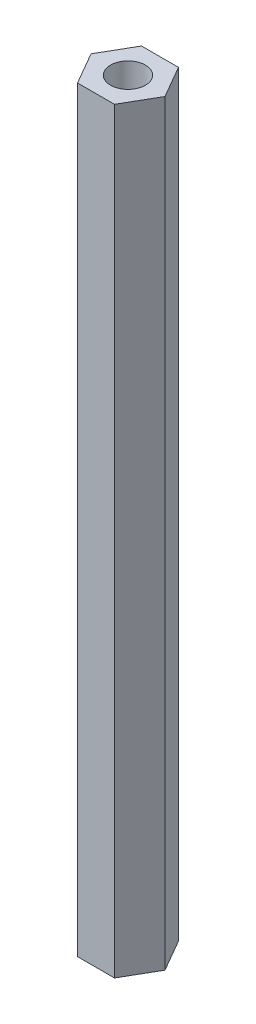
ISO-10303-21;
HEADER;
FILE_DESCRIPTION(('STEP AP214'),'2;1');
FILE_NAME('part.step','',(''),(''),'','','');
FILE_SCHEMA(('AUTOMOTIVE_DESIGN { 1 0 10303 214 1 1 1 1 }'));
ENDSEC;
DATA;
#1=APPLICATION_CONTEXT('core data for automotive mechanical design processes');
#2=APPLICATION_PROTOCOL_DEFINITION('international standard','automotive_design',2000,#1);
#3=PRODUCT_CONTEXT('',#1,'mechanical');
#4=PRODUCT('Part','Part','',(#3));
#5=PRODUCT_RELATED_PRODUCT_CATEGORY('part','',(#4));
#6=PRODUCT_DEFINITION_FORMATION('','',#4);
#7=PRODUCT_DEFINITION_CONTEXT('part definition',#1,'design');
#8=PRODUCT_DEFINITION('design','',#6,#7);
#9=PRODUCT_DEFINITION_SHAPE('','',#8);
#10=(LENGTH_UNIT() NAMED_UNIT(*) SI_UNIT(.MILLI.,.METRE.));
#11=(NAMED_UNIT(*) PLANE_ANGLE_UNIT() SI_UNIT($,.RADIAN.));
#12=(NAMED_UNIT(*) SI_UNIT($,.STERADIAN.) SOLID_ANGLE_UNIT());
#13=UNCERTAINTY_MEASURE_WITH_UNIT(LENGTH_MEASURE(1.E-05),#10,'distance_accuracy_value','');
#14=(GEOMETRIC_REPRESENTATION_CONTEXT(3) GLOBAL_UNCERTAINTY_ASSIGNED_CONTEXT((#13)) GLOBAL_UNIT_ASSIGNED_CONTEXT((#10,
#11,#12)) REPRESENTATION_CONTEXT('',''));
#15=CARTESIAN_POINT('',(0.,0.,0.));
#16=DIRECTION('',(0.,0.,1.));
#17=DIRECTION('',(1.,0.,0.));
#18=AXIS2_PLACEMENT_3D('',#15,#16,#17);
#19=CARTESIAN_POINT('',(1.5877132402715,65.,2.74999999999997));
#20=DIRECTION('',(-0.866025403784441,0.,-0.499999999999995));
#21=DIRECTION('',(-0.499999999999995,0.,0.866025403784442));
#22=AXIS2_PLACEMENT_3D('',#19,#20,#21);
#23=PLANE('',#22);
#24=DIRECTION('',(0.499999999999995,0.,-0.866025403784441));
#25=VECTOR('',#24,1.);
#26=CARTESIAN_POINT('',(1.5877132402715,0.,2.74999999999997));
#27=LINE('',#26,#25);
#28=CARTESIAN_POINT('',(1.5877132402715,0.,2.74999999999997));
#29=VERTEX_POINT('',#28);
#30=CARTESIAN_POINT('',(3.17542648054293,0.,0.));
#31=VERTEX_POINT('',#30);
#32=EDGE_CURVE('E117',#29,#31,#27,.T.);
#33=ORIENTED_EDGE('',*,*,#32,.T.);
#34=DIRECTION('',(0.,-1.,0.));
#35=VECTOR('',#34,1.);
#36=CARTESIAN_POINT('',(3.17542648054293,65.,0.));
#37=LINE('',#36,#35);
#38=CARTESIAN_POINT('',(3.17542648054293,65.,0.));
#39=VERTEX_POINT('',#38);
#40=EDGE_CURVE('E11',#39,#31,#37,.T.);
#41=ORIENTED_EDGE('',*,*,#40,.F.);
#42=DIRECTION('',(0.499999999999995,0.,-0.866025403784441));
#43=VECTOR('',#42,1.);
#44=CARTESIAN_POINT('',(1.5877132402715,65.,2.74999999999997));
#45=LINE('',#44,#43);
#46=CARTESIAN_POINT('',(1.5877132402715,65.,2.74999999999997));
#47=VERTEX_POINT('',#46);
#48=EDGE_CURVE('E128',#47,#39,#45,.T.);
#49=ORIENTED_EDGE('',*,*,#48,.F.);
#50=DIRECTION('',(0.,-1.,0.));
#51=VECTOR('',#50,1.);
#52=CARTESIAN_POINT('',(1.5877132402715,65.,2.74999999999997));
#53=LINE('',#52,#51);
#54=EDGE_CURVE('E113',#47,#29,#53,.T.);
#55=ORIENTED_EDGE('',*,*,#54,.T.);
#56=EDGE_LOOP('',(#33,#41,#49,#55));
#57=FACE_BOUND('',#56,.T.);
#58=ADVANCED_FACE('F33',(#57),#23,.F.);
#59=CARTESIAN_POINT('',(3.17542648054293,65.,0.));
#60=DIRECTION('',(-0.866025403784438,0.,0.500000000000001));
#61=DIRECTION('',(0.500000000000001,0.,0.866025403784438));
#62=AXIS2_PLACEMENT_3D('',#59,#60,#61);
#63=PLANE('',#62);
#64=DIRECTION('',(-0.500000000000001,0.,-0.866025403784438));
#65=VECTOR('',#64,1.);
#66=CARTESIAN_POINT('',(3.17542648054293,0.,0.));
#67=LINE('',#66,#65);
#68=CARTESIAN_POINT('',(1.58771324027146,0.,-2.74999999999999));
#69=VERTEX_POINT('',#68);
#70=EDGE_CURVE('E120',#31,#69,#67,.T.);
#71=ORIENTED_EDGE('',*,*,#70,.T.);
#72=DIRECTION('',(0.,-1.,0.));
#73=VECTOR('',#72,1.);
#74=CARTESIAN_POINT('',(1.58771324027146,65.,-2.74999999999999));
#75=LINE('',#74,#73);
#76=CARTESIAN_POINT('',(1.58771324027146,65.,-2.74999999999999));
#77=VERTEX_POINT('',#76);
#78=EDGE_CURVE('E41',#77,#69,#75,.T.);
#79=ORIENTED_EDGE('',*,*,#78,.F.);
#80=DIRECTION('',(-0.500000000000001,0.,-0.866025403784438));
#81=VECTOR('',#80,1.);
#82=CARTESIAN_POINT('',(3.17542648054293,65.,0.));
#83=LINE('',#82,#81);
#84=EDGE_CURVE('E86',#39,#77,#83,.T.);
#85=ORIENTED_EDGE('',*,*,#84,.F.);
#86=ORIENTED_EDGE('',*,*,#40,.T.);
#87=EDGE_LOOP('',(#71,#79,#85,#86));
#88=FACE_BOUND('',#87,.T.);
#89=ADVANCED_FACE('F153',(#88),#63,.F.);
#90=CARTESIAN_POINT('',(1.58771324027146,65.,-2.74999999999999));
#91=DIRECTION('',(0.,0.,1.));
#92=DIRECTION('',(1.,0.,0.));
#93=AXIS2_PLACEMENT_3D('',#90,#91,#92);
#94=PLANE('',#93);
#95=DIRECTION('',(-1.,0.,0.));
#96=VECTOR('',#95,1.);
#97=CARTESIAN_POINT('',(1.58771324027146,0.,-2.74999999999999));
#98=LINE('',#97,#96);
#99=CARTESIAN_POINT('',(-1.58771324027148,0.,-2.74999999999998));
#100=VERTEX_POINT('',#99);
#101=EDGE_CURVE('E123',#69,#100,#98,.T.);
#102=ORIENTED_EDGE('',*,*,#101,.T.);
#103=DIRECTION('',(0.,-1.,0.));
#104=VECTOR('',#103,1.);
#105=CARTESIAN_POINT('',(-1.58771324027148,65.,-2.74999999999998));
#106=LINE('',#105,#104);
#107=CARTESIAN_POINT('',(-1.58771324027148,65.,-2.74999999999998));
#108=VERTEX_POINT('',#107);
#109=EDGE_CURVE('E108',#108,#100,#106,.T.);
#110=ORIENTED_EDGE('',*,*,#109,.F.);
#111=DIRECTION('',(-1.,0.,0.));
#112=VECTOR('',#111,1.);
#113=CARTESIAN_POINT('',(1.58771324027146,65.,-2.74999999999999));
#114=LINE('',#113,#112);
#115=EDGE_CURVE('E99',#77,#108,#114,.T.);
#116=ORIENTED_EDGE('',*,*,#115,.F.);
#117=ORIENTED_EDGE('',*,*,#78,.T.);
#118=EDGE_LOOP('',(#102,#110,#116,#117));
#119=FACE_BOUND('',#118,.T.);
#120=ADVANCED_FACE('F134',(#119),#94,.F.);
#121=CARTESIAN_POINT('',(-1.58771324027148,65.,-2.74999999999998));
#122=DIRECTION('',(0.866025403784441,0.,0.499999999999995));
#123=DIRECTION('',(0.499999999999995,0.,-0.866025403784442));
#124=AXIS2_PLACEMENT_3D('',#121,#122,#123);
#125=PLANE('',#124);
#126=DIRECTION('',(-0.499999999999995,0.,0.866025403784442));
#127=VECTOR('',#126,1.);
#128=CARTESIAN_POINT('',(-1.58771324027148,0.,-2.74999999999998));
#129=LINE('',#128,#127);
#130=CARTESIAN_POINT('',(-3.17542648054293,0.,0.));
#131=VERTEX_POINT('',#130);
#132=EDGE_CURVE('E107',#100,#131,#129,.T.);
#133=ORIENTED_EDGE('',*,*,#132,.T.);
#134=DIRECTION('',(0.,-1.,0.));
#135=VECTOR('',#134,1.);
#136=CARTESIAN_POINT('',(-3.17542648054293,65.,0.));
#137=LINE('',#136,#135);
#138=CARTESIAN_POINT('',(-3.17542648054293,65.,0.));
#139=VERTEX_POINT('',#138);
#140=EDGE_CURVE('E104',#139,#131,#137,.T.);
#141=ORIENTED_EDGE('',*,*,#140,.F.);
#142=DIRECTION('',(-0.499999999999995,0.,0.866025403784442));
#143=VECTOR('',#142,1.);
#144=CARTESIAN_POINT('',(-1.58771324027148,65.,-2.74999999999998));
#145=LINE('',#144,#143);
#146=EDGE_CURVE('E93',#108,#139,#145,.T.);
#147=ORIENTED_EDGE('',*,*,#146,.F.);
#148=ORIENTED_EDGE('',*,*,#109,.T.);
#149=EDGE_LOOP('',(#133,#141,#147,#148));
#150=FACE_BOUND('',#149,.T.);
#151=ADVANCED_FACE('F105',(#150),#125,.F.);
#152=CARTESIAN_POINT('',(-3.17542648054293,65.,0.));
#153=DIRECTION('',(0.866025403784434,0.,-0.500000000000007));
#154=DIRECTION('',(-0.500000000000007,0.,-0.866025403784435));
#155=AXIS2_PLACEMENT_3D('',#152,#153,#154);
#156=PLANE('',#155);
#157=DIRECTION('',(0.500000000000007,0.,0.866025403784435));
#158=VECTOR('',#157,1.);
#159=CARTESIAN_POINT('',(-3.17542648054293,0.,0.));
#160=LINE('',#159,#158);
#161=CARTESIAN_POINT('',(-1.58771324027144,0.,2.75));
#162=VERTEX_POINT('',#161);
#163=EDGE_CURVE('E72',#131,#162,#160,.T.);
#164=ORIENTED_EDGE('',*,*,#163,.T.);
#165=DIRECTION('',(0.,-1.,0.));
#166=VECTOR('',#165,1.);
#167=CARTESIAN_POINT('',(-1.58771324027144,65.,2.75));
#168=LINE('',#167,#166);
#169=CARTESIAN_POINT('',(-1.58771324027144,65.,2.75));
#170=VERTEX_POINT('',#169);
#171=EDGE_CURVE('E109',#170,#162,#168,.T.);
#172=ORIENTED_EDGE('',*,*,#171,.F.);
#173=DIRECTION('',(0.500000000000007,0.,0.866025403784435));
#174=VECTOR('',#173,1.);
#175=CARTESIAN_POINT('',(-3.17542648054293,65.,0.));
#176=LINE('',#175,#174);
#177=EDGE_CURVE('E97',#139,#170,#176,.T.);
#178=ORIENTED_EDGE('',*,*,#177,.F.);
#179=ORIENTED_EDGE('',*,*,#140,.T.);
#180=EDGE_LOOP('',(#164,#172,#178,#179));
#181=FACE_BOUND('',#180,.T.);
#182=ADVANCED_FACE('F111',(#181),#156,.F.);
#183=CARTESIAN_POINT('',(-1.58771324027144,65.,2.75));
#184=DIRECTION('',(0.,0.,-1.));
#185=DIRECTION('',(-1.,0.,0.));
#186=AXIS2_PLACEMENT_3D('',#183,#184,#185);
#187=PLANE('',#186);
#188=DIRECTION('',(1.,0.,0.));
#189=VECTOR('',#188,1.);
#190=CARTESIAN_POINT('',(-1.58771324027144,0.,2.75));
#191=LINE('',#190,#189);
#192=EDGE_CURVE('E78',#162,#29,#191,.T.);
#193=ORIENTED_EDGE('',*,*,#192,.T.);
#194=ORIENTED_EDGE('',*,*,#54,.F.);
#195=DIRECTION('',(1.,0.,0.));
#196=VECTOR('',#195,1.);
#197=CARTESIAN_POINT('',(-1.58771324027144,65.,2.75));
#198=LINE('',#197,#196);
#199=EDGE_CURVE('E49',#170,#47,#198,.T.);
#200=ORIENTED_EDGE('',*,*,#199,.F.);
#201=ORIENTED_EDGE('',*,*,#171,.T.);
#202=EDGE_LOOP('',(#193,#194,#200,#201));
#203=FACE_BOUND('',#202,.T.);
#204=ADVANCED_FACE('F141',(#203),#187,.F.);
#205=CARTESIAN_POINT('',(0.,65.,0.));
#206=DIRECTION('',(0.,1.,0.));
#207=DIRECTION('',(0.,0.,1.));
#208=AXIS2_PLACEMENT_3D('',#205,#206,#207);
#209=PLANE('',#208);
#210=CARTESIAN_POINT('',(0.,65.,0.));
#211=DIRECTION('',(0.,1.,0.));
#212=DIRECTION('',(0.,0.,1.));
#213=AXIS2_PLACEMENT_3D('',#210,#211,#212);
#214=CIRCLE('',#213,1.5);
#215=CARTESIAN_POINT('',(0.,65.,1.5));
#216=VERTEX_POINT('',#215);
#217=EDGE_CURVE('E236',#216,#216,#214,.T.);
#218=ORIENTED_EDGE('',*,*,#217,.F.);
#219=EDGE_LOOP('',(#218));
#220=FACE_BOUND('',#219,.T.);
#221=ORIENTED_EDGE('',*,*,#48,.T.);
#222=ORIENTED_EDGE('',*,*,#84,.T.);
#223=ORIENTED_EDGE('',*,*,#115,.T.);
#224=ORIENTED_EDGE('',*,*,#146,.T.);
#225=ORIENTED_EDGE('',*,*,#177,.T.);
#226=ORIENTED_EDGE('',*,*,#199,.T.);
#227=EDGE_LOOP('',(#221,#222,#223,#224,#225,#226));
#228=FACE_BOUND('',#227,.T.);
#229=ADVANCED_FACE('F95',(#220,#228),#209,.T.);
#230=CARTESIAN_POINT('',(0.,0.,0.));
#231=DIRECTION('',(0.,1.,0.));
#232=DIRECTION('',(0.,0.,1.));
#233=AXIS2_PLACEMENT_3D('',#230,#231,#232);
#234=PLANE('',#233);
#235=CARTESIAN_POINT('',(0.,0.,0.));
#236=DIRECTION('',(0.,1.,0.));
#237=DIRECTION('',(0.,0.,1.));
#238=AXIS2_PLACEMENT_3D('',#235,#236,#237);
#239=CIRCLE('',#238,1.5);
#240=CARTESIAN_POINT('',(0.,0.,1.5));
#241=VERTEX_POINT('',#240);
#242=EDGE_CURVE('E237',#241,#241,#239,.T.);
#243=ORIENTED_EDGE('',*,*,#242,.T.);
#244=EDGE_LOOP('',(#243));
#245=FACE_BOUND('',#244,.T.);
#246=ORIENTED_EDGE('',*,*,#32,.F.);
#247=ORIENTED_EDGE('',*,*,#192,.F.);
#248=ORIENTED_EDGE('',*,*,#163,.F.);
#249=ORIENTED_EDGE('',*,*,#132,.F.);
#250=ORIENTED_EDGE('',*,*,#101,.F.);
#251=ORIENTED_EDGE('',*,*,#70,.F.);
#252=EDGE_LOOP('',(#246,#247,#248,#249,#250,#251));
#253=FACE_BOUND('',#252,.T.);
#254=ADVANCED_FACE('F137',(#245,#253),#234,.F.);
#255=CARTESIAN_POINT('',(0.,55.,0.));
#256=DIRECTION('',(0.,1.,0.));
#257=DIRECTION('',(0.,0.,1.));
#258=AXIS2_PLACEMENT_3D('',#255,#256,#257);
#259=CYLINDRICAL_SURFACE('',#258,1.5);
#260=CARTESIAN_POINT('',(0.,55.,0.));
#261=DIRECTION('',(0.,1.,0.));
#262=DIRECTION('',(0.,0.,1.));
#263=AXIS2_PLACEMENT_3D('',#260,#261,#262);
#264=CIRCLE('',#263,1.5);
#265=CARTESIAN_POINT('',(0.,55.,1.5));
#266=VERTEX_POINT('',#265);
#267=EDGE_CURVE('E121',#266,#266,#264,.T.);
#268=ORIENTED_EDGE('',*,*,#267,.F.);
#269=EDGE_LOOP('',(#268));
#270=FACE_BOUND('',#269,.T.);
#271=ORIENTED_EDGE('',*,*,#217,.T.);
#272=EDGE_LOOP('',(#271));
#273=FACE_BOUND('',#272,.T.);
#274=ADVANCED_FACE('F188',(#270,#273),#259,.F.);
#275=CARTESIAN_POINT('',(0.,55.,0.));
#276=DIRECTION('',(0.,1.,0.));
#277=DIRECTION('',(0.,0.,1.));
#278=AXIS2_PLACEMENT_3D('',#275,#276,#277);
#279=PLANE('',#278);
#280=ORIENTED_EDGE('',*,*,#267,.T.);
#281=EDGE_LOOP('',(#280));
#282=FACE_BOUND('',#281,.T.);
#283=ADVANCED_FACE('F193',(#282),#279,.T.);
#284=CARTESIAN_POINT('',(0.,10.,0.));
#285=DIRECTION('',(0.,-1.,0.));
#286=DIRECTION('',(0.,0.,-1.));
#287=AXIS2_PLACEMENT_3D('',#284,#285,#286);
#288=CYLINDRICAL_SURFACE('',#287,1.5);
#289=CARTESIAN_POINT('',(0.,10.,0.));
#290=DIRECTION('',(0.,1.,0.));
#291=DIRECTION('',(0.,0.,1.));
#292=AXIS2_PLACEMENT_3D('',#289,#290,#291);
#293=CIRCLE('',#292,1.5);
#294=CARTESIAN_POINT('',(0.,10.,1.5));
#295=VERTEX_POINT('',#294);
#296=EDGE_CURVE('E235',#295,#295,#293,.T.);
#297=ORIENTED_EDGE('',*,*,#296,.T.);
#298=EDGE_LOOP('',(#297));
#299=FACE_BOUND('',#298,.T.);
#300=ORIENTED_EDGE('',*,*,#242,.F.);
#301=EDGE_LOOP('',(#300));
#302=FACE_BOUND('',#301,.T.);
#303=ADVANCED_FACE('F203',(#299,#302),#288,.F.);
#304=CARTESIAN_POINT('',(0.,10.,0.));
#305=DIRECTION('',(0.,-1.,0.));
#306=DIRECTION('',(0.,0.,1.));
#307=AXIS2_PLACEMENT_3D('',#304,#305,#306);
#308=PLANE('',#307);
#309=ORIENTED_EDGE('',*,*,#296,.F.);
#310=EDGE_LOOP('',(#309));
#311=FACE_BOUND('',#310,.T.);
#312=ADVANCED_FACE('F219',(#311),#308,.T.);
#313=CLOSED_SHELL('',(#58,#89,#120,#151,#182,#204,#229,#254,#274,#283,#303,#312));
#314=MANIFOLD_SOLID_BREP('B2',#313);
#315=ADVANCED_BREP_SHAPE_REPRESENTATION('',(#18,#314),#14);
#316=SHAPE_DEFINITION_REPRESENTATION(#9,#315);
ENDSEC;
END-ISO-10303-21;
